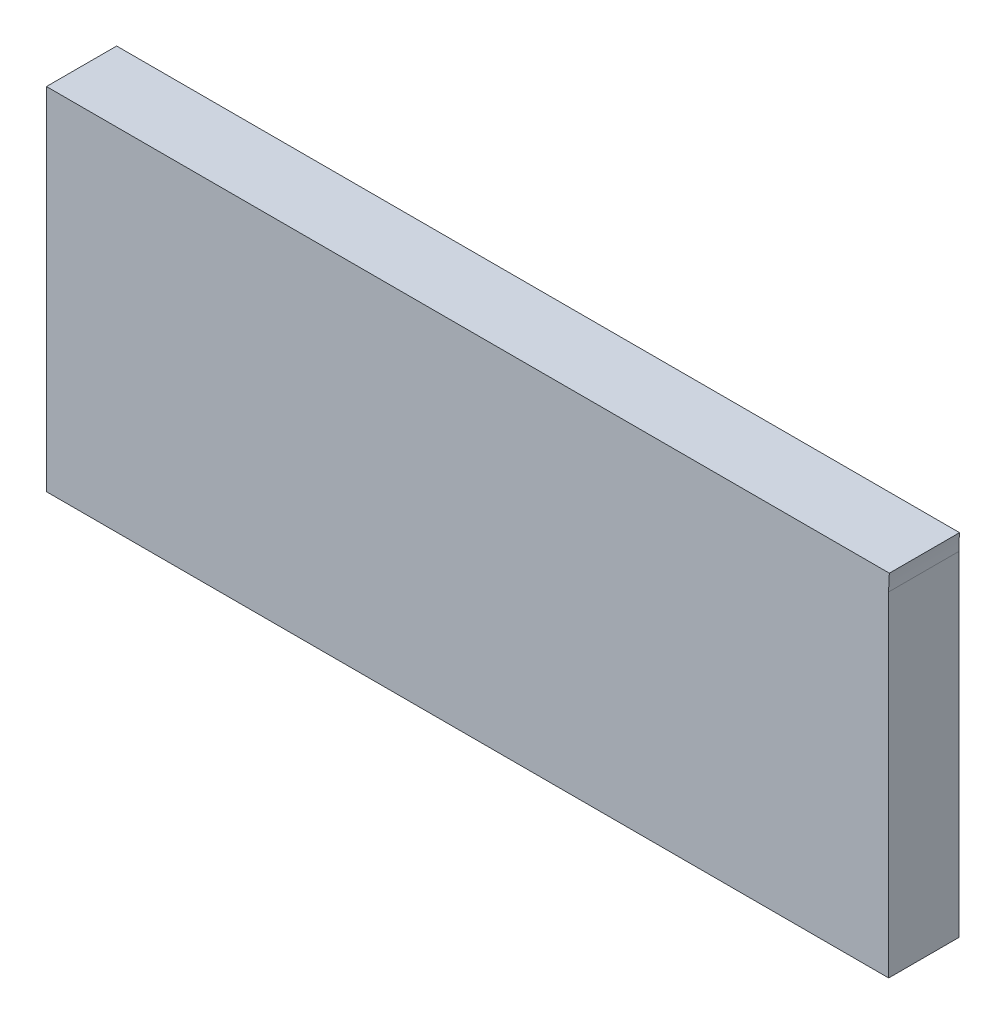
ISO-10303-21;
HEADER;
FILE_DESCRIPTION(('STEP AP214'),'2;1');
FILE_NAME('part.step','',(''),(''),'','','');
FILE_SCHEMA(('AUTOMOTIVE_DESIGN { 1 0 10303 214 1 1 1 1 }'));
ENDSEC;
DATA;
#1=APPLICATION_CONTEXT('core data for automotive mechanical design processes');
#2=APPLICATION_PROTOCOL_DEFINITION('international standard','automotive_design',2000,#1);
#3=PRODUCT_CONTEXT('',#1,'mechanical');
#4=PRODUCT('Part','Part','',(#3));
#5=PRODUCT_RELATED_PRODUCT_CATEGORY('part','',(#4));
#6=PRODUCT_DEFINITION_FORMATION('','',#4);
#7=PRODUCT_DEFINITION_CONTEXT('part definition',#1,'design');
#8=PRODUCT_DEFINITION('design','',#6,#7);
#9=PRODUCT_DEFINITION_SHAPE('','',#8);
#10=(LENGTH_UNIT() NAMED_UNIT(*) SI_UNIT(.MILLI.,.METRE.));
#11=(NAMED_UNIT(*) PLANE_ANGLE_UNIT() SI_UNIT($,.RADIAN.));
#12=(NAMED_UNIT(*) SI_UNIT($,.STERADIAN.) SOLID_ANGLE_UNIT());
#13=UNCERTAINTY_MEASURE_WITH_UNIT(LENGTH_MEASURE(1.E-05),#10,'distance_accuracy_value','');
#14=(GEOMETRIC_REPRESENTATION_CONTEXT(3) GLOBAL_UNCERTAINTY_ASSIGNED_CONTEXT((#13)) GLOBAL_UNIT_ASSIGNED_CONTEXT((#10,
#11,#12)) REPRESENTATION_CONTEXT('',''));
#15=CARTESIAN_POINT('',(0.,0.,0.));
#16=DIRECTION('',(0.,0.,1.));
#17=DIRECTION('',(1.,0.,0.));
#18=AXIS2_PLACEMENT_3D('',#15,#16,#17);
#19=CARTESIAN_POINT('',(1.025,-1.2,0.1));
#20=DIRECTION('',(0.,0.,1.));
#21=DIRECTION('',(1.,0.,0.));
#22=AXIS2_PLACEMENT_3D('',#19,#20,#21);
#23=PLANE('',#22);
#24=DIRECTION('',(0.,1.,0.));
#25=VECTOR('',#24,1.);
#26=CARTESIAN_POINT('',(2.225,-2.,0.1));
#27=LINE('',#26,#25);
#28=CARTESIAN_POINT('',(2.225,-1.52360679774998,0.1));
#29=VERTEX_POINT('',#28);
#30=CARTESIAN_POINT('',(2.225,-2.,0.1));
#31=VERTEX_POINT('',#30);
#32=EDGE_CURVE('E61',#29,#31,#27,.F.);
#33=ORIENTED_EDGE('',*,*,#32,.F.);
#34=CARTESIAN_POINT('',(2.525,-1.52360679774998,0.1));
#35=DIRECTION('',(0.,0.,1.));
#36=DIRECTION('',(1.,0.,0.));
#37=AXIS2_PLACEMENT_3D('',#34,#35,#36);
#38=CIRCLE('',#37,0.3);
#39=CARTESIAN_POINT('',(2.22593024375575,-1.5,0.1));
#40=VERTEX_POINT('',#39);
#41=EDGE_CURVE('E20',#29,#40,#38,.F.);
#42=ORIENTED_EDGE('',*,*,#41,.T.);
#43=DIRECTION('',(1.,0.,0.));
#44=VECTOR('',#43,1.);
#45=CARTESIAN_POINT('',(-3.17433908045977,-1.5,0.1));
#46=LINE('',#45,#44);
#47=CARTESIAN_POINT('',(1.025,-1.5,0.1));
#48=VERTEX_POINT('',#47);
#49=EDGE_CURVE('E65',#40,#48,#46,.F.);
#50=ORIENTED_EDGE('',*,*,#49,.T.);
#51=DIRECTION('',(0.,1.,0.));
#52=VECTOR('',#51,1.);
#53=CARTESIAN_POINT('',(1.025,-1.35,0.1));
#54=LINE('',#53,#52);
#55=CARTESIAN_POINT('',(1.025,-2.,0.1));
#56=VERTEX_POINT('',#55);
#57=EDGE_CURVE('E92',#56,#48,#54,.T.);
#58=ORIENTED_EDGE('',*,*,#57,.F.);
#59=DIRECTION('',(1.,0.,0.));
#60=VECTOR('',#59,1.);
#61=CARTESIAN_POINT('',(1.025,-2.,0.1));
#62=LINE('',#61,#60);
#63=EDGE_CURVE('E102',#31,#56,#62,.F.);
#64=ORIENTED_EDGE('',*,*,#63,.F.);
#65=EDGE_LOOP('',(#33,#42,#50,#58,#64));
#66=FACE_BOUND('',#65,.T.);
#67=ADVANCED_FACE('F17',(#66),#23,.T.);
#68=CARTESIAN_POINT('',(1.025,-2.,0.));
#69=DIRECTION('',(0.,-1.,0.));
#70=DIRECTION('',(0.,0.,-1.));
#71=AXIS2_PLACEMENT_3D('',#68,#69,#70);
#72=PLANE('',#71);
#73=DIRECTION('',(1.,0.,0.));
#74=VECTOR('',#73,1.);
#75=CARTESIAN_POINT('',(1.025,-2.,0.));
#76=LINE('',#75,#74);
#77=CARTESIAN_POINT('',(1.025,-2.,0.));
#78=VERTEX_POINT('',#77);
#79=CARTESIAN_POINT('',(2.225,-2.,0.));
#80=VERTEX_POINT('',#79);
#81=EDGE_CURVE('E88',#78,#80,#76,.T.);
#82=ORIENTED_EDGE('',*,*,#81,.T.);
#83=DIRECTION('',(0.,0.,-1.));
#84=VECTOR('',#83,1.);
#85=CARTESIAN_POINT('',(2.225,-2.,0.));
#86=LINE('',#85,#84);
#87=EDGE_CURVE('E84',#31,#80,#86,.T.);
#88=ORIENTED_EDGE('',*,*,#87,.F.);
#89=ORIENTED_EDGE('',*,*,#63,.T.);
#90=DIRECTION('',(0.,0.,1.));
#91=VECTOR('',#90,1.);
#92=CARTESIAN_POINT('',(1.025,-2.,0.));
#93=LINE('',#92,#91);
#94=EDGE_CURVE('E95',#78,#56,#93,.T.);
#95=ORIENTED_EDGE('',*,*,#94,.F.);
#96=EDGE_LOOP('',(#82,#88,#89,#95));
#97=FACE_BOUND('',#96,.T.);
#98=ADVANCED_FACE('F125',(#97),#72,.T.);
#99=CARTESIAN_POINT('',(2.225,-2.,0.));
#100=DIRECTION('',(1.,0.,0.));
#101=DIRECTION('',(0.,0.,-1.));
#102=AXIS2_PLACEMENT_3D('',#99,#100,#101);
#103=PLANE('',#102);
#104=ORIENTED_EDGE('',*,*,#32,.T.);
#105=ORIENTED_EDGE('',*,*,#87,.T.);
#106=DIRECTION('',(0.,1.,0.));
#107=VECTOR('',#106,1.);
#108=CARTESIAN_POINT('',(2.225,-1.2,0.));
#109=LINE('',#108,#107);
#110=CARTESIAN_POINT('',(2.225,-1.52360679774998,0.));
#111=VERTEX_POINT('',#110);
#112=EDGE_CURVE('E91',#80,#111,#109,.T.);
#113=ORIENTED_EDGE('',*,*,#112,.T.);
#114=DIRECTION('',(0.,0.,-1.));
#115=VECTOR('',#114,1.);
#116=CARTESIAN_POINT('',(2.225,-1.52360679774998,0.));
#117=LINE('',#116,#115);
#118=EDGE_CURVE('E70',#111,#29,#117,.F.);
#119=ORIENTED_EDGE('',*,*,#118,.T.);
#120=EDGE_LOOP('',(#104,#105,#113,#119));
#121=FACE_BOUND('',#120,.T.);
#122=ADVANCED_FACE('F118',(#121),#103,.T.);
#123=CARTESIAN_POINT('',(2.525,-1.52360679774998,0.));
#124=DIRECTION('',(0.,0.,-1.));
#125=DIRECTION('',(-1.,0.,0.));
#126=AXIS2_PLACEMENT_3D('',#123,#124,#125);
#127=CYLINDRICAL_SURFACE('',#126,0.3);
#128=DIRECTION('',(0.,0.,1.));
#129=VECTOR('',#128,1.);
#130=CARTESIAN_POINT('',(2.22593024375575,-1.5,-0.359021698729691));
#131=LINE('',#130,#129);
#132=CARTESIAN_POINT('',(2.22593024375575,-1.5,0.));
#133=VERTEX_POINT('',#132);
#134=EDGE_CURVE('E69',#133,#40,#131,.T.);
#135=ORIENTED_EDGE('',*,*,#134,.T.);
#136=ORIENTED_EDGE('',*,*,#41,.F.);
#137=ORIENTED_EDGE('',*,*,#118,.F.);
#138=CARTESIAN_POINT('',(2.525,-1.52360679774998,0.));
#139=DIRECTION('',(0.,0.,-1.));
#140=DIRECTION('',(-1.,0.,0.));
#141=AXIS2_PLACEMENT_3D('',#138,#139,#140);
#142=CIRCLE('',#141,0.3);
#143=EDGE_CURVE('E79',#111,#133,#142,.T.);
#144=ORIENTED_EDGE('',*,*,#143,.T.);
#145=EDGE_LOOP('',(#135,#136,#137,#144));
#146=FACE_BOUND('',#145,.T.);
#147=ADVANCED_FACE('F77',(#146),#127,.F.);
#148=CARTESIAN_POINT('',(-3.17433908045977,-1.5,-0.359021698729691));
#149=DIRECTION('',(0.,-1.,0.));
#150=DIRECTION('',(1.,0.,0.));
#151=AXIS2_PLACEMENT_3D('',#148,#149,#150);
#152=PLANE('',#151);
#153=ORIENTED_EDGE('',*,*,#49,.F.);
#154=ORIENTED_EDGE('',*,*,#134,.F.);
#155=DIRECTION('',(1.,0.,0.));
#156=VECTOR('',#155,1.);
#157=CARTESIAN_POINT('',(1.025,-1.5,0.));
#158=LINE('',#157,#156);
#159=CARTESIAN_POINT('',(1.025,-1.5,0.));
#160=VERTEX_POINT('',#159);
#161=EDGE_CURVE('E26',#133,#160,#158,.F.);
#162=ORIENTED_EDGE('',*,*,#161,.T.);
#163=DIRECTION('',(0.,0.,1.));
#164=VECTOR('',#163,1.);
#165=CARTESIAN_POINT('',(1.025,-1.5,0.));
#166=LINE('',#165,#164);
#167=EDGE_CURVE('E34',#48,#160,#166,.F.);
#168=ORIENTED_EDGE('',*,*,#167,.F.);
#169=EDGE_LOOP('',(#153,#154,#162,#168));
#170=FACE_BOUND('',#169,.T.);
#171=ADVANCED_FACE('F72',(#170),#152,.F.);
#172=CARTESIAN_POINT('',(1.025,-1.35,0.));
#173=DIRECTION('',(-1.,0.,0.));
#174=DIRECTION('',(0.,0.,1.));
#175=AXIS2_PLACEMENT_3D('',#172,#173,#174);
#176=PLANE('',#175);
#177=ORIENTED_EDGE('',*,*,#94,.T.);
#178=ORIENTED_EDGE('',*,*,#57,.T.);
#179=ORIENTED_EDGE('',*,*,#167,.T.);
#180=DIRECTION('',(0.,1.,0.));
#181=VECTOR('',#180,1.);
#182=CARTESIAN_POINT('',(1.025,-1.2,0.));
#183=LINE('',#182,#181);
#184=EDGE_CURVE('E11',#160,#78,#183,.F.);
#185=ORIENTED_EDGE('',*,*,#184,.T.);
#186=EDGE_LOOP('',(#177,#178,#179,#185));
#187=FACE_BOUND('',#186,.T.);
#188=ADVANCED_FACE('F122',(#187),#176,.T.);
#189=CARTESIAN_POINT('',(1.025,-1.2,0.));
#190=DIRECTION('',(0.,0.,1.));
#191=DIRECTION('',(1.,0.,0.));
#192=AXIS2_PLACEMENT_3D('',#189,#190,#191);
#193=PLANE('',#192);
#194=ORIENTED_EDGE('',*,*,#161,.F.);
#195=ORIENTED_EDGE('',*,*,#143,.F.);
#196=ORIENTED_EDGE('',*,*,#112,.F.);
#197=ORIENTED_EDGE('',*,*,#81,.F.);
#198=ORIENTED_EDGE('',*,*,#184,.F.);
#199=EDGE_LOOP('',(#194,#195,#196,#197,#198));
#200=FACE_BOUND('',#199,.T.);
#201=ADVANCED_FACE('F120',(#200),#193,.F.);
#202=CLOSED_SHELL('',(#67,#98,#122,#147,#171,#188,#201));
#203=MANIFOLD_SOLID_BREP('B1',#202);
#204=ADVANCED_BREP_SHAPE_REPRESENTATION('',(#18,#203),#14);
#205=SHAPE_DEFINITION_REPRESENTATION(#9,#204);
ENDSEC;
END-ISO-10303-21;
